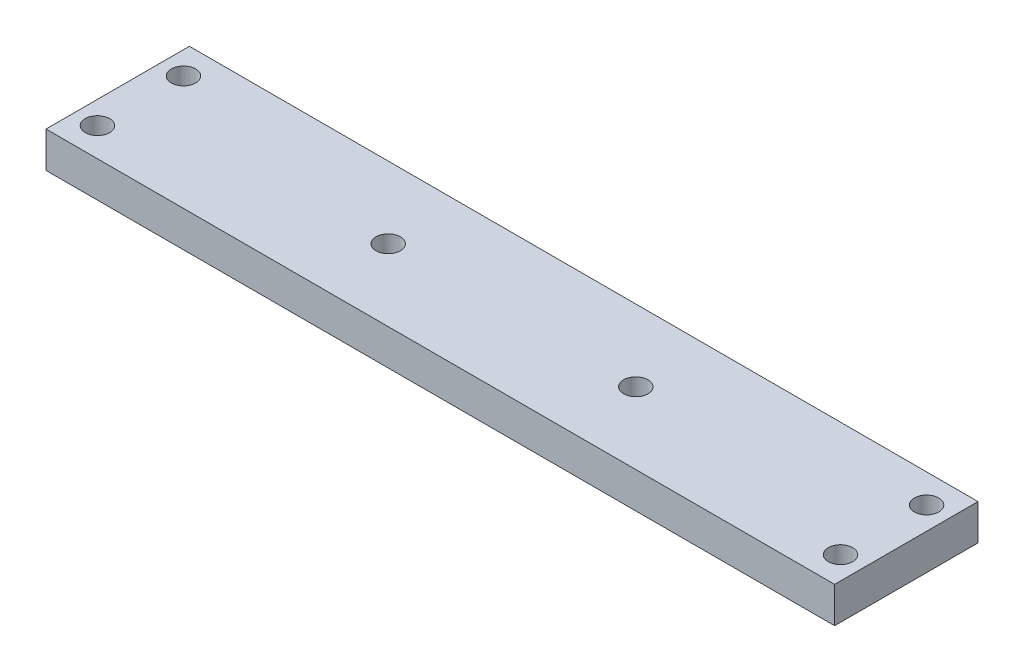
ISO-10303-21;
HEADER;
FILE_DESCRIPTION(('STEP AP214'),'2;1');
FILE_NAME('part.step','',(''),(''),'','','');
FILE_SCHEMA(('AUTOMOTIVE_DESIGN { 1 0 10303 214 1 1 1 1 }'));
ENDSEC;
DATA;
#1=APPLICATION_CONTEXT('core data for automotive mechanical design processes');
#2=APPLICATION_PROTOCOL_DEFINITION('international standard','automotive_design',2000,#1);
#3=PRODUCT_CONTEXT('',#1,'mechanical');
#4=PRODUCT('Part','Part','',(#3));
#5=PRODUCT_RELATED_PRODUCT_CATEGORY('part','',(#4));
#6=PRODUCT_DEFINITION_FORMATION('','',#4);
#7=PRODUCT_DEFINITION_CONTEXT('part definition',#1,'design');
#8=PRODUCT_DEFINITION('design','',#6,#7);
#9=PRODUCT_DEFINITION_SHAPE('','',#8);
#10=(LENGTH_UNIT() NAMED_UNIT(*) SI_UNIT(.MILLI.,.METRE.));
#11=(NAMED_UNIT(*) PLANE_ANGLE_UNIT() SI_UNIT($,.RADIAN.));
#12=(NAMED_UNIT(*) SI_UNIT($,.STERADIAN.) SOLID_ANGLE_UNIT());
#13=UNCERTAINTY_MEASURE_WITH_UNIT(LENGTH_MEASURE(1.E-05),#10,'distance_accuracy_value','');
#14=(GEOMETRIC_REPRESENTATION_CONTEXT(3) GLOBAL_UNCERTAINTY_ASSIGNED_CONTEXT((#13)) GLOBAL_UNIT_ASSIGNED_CONTEXT((#10,
#11,#12)) REPRESENTATION_CONTEXT('',''));
#15=CARTESIAN_POINT('',(0.,0.,0.));
#16=DIRECTION('',(0.,0.,1.));
#17=DIRECTION('',(1.,0.,0.));
#18=AXIS2_PLACEMENT_3D('',#15,#16,#17);
#19=CARTESIAN_POINT('',(0.,-2.5,0.));
#20=DIRECTION('',(0.,-1.,0.));
#21=DIRECTION('',(0.,0.,-1.));
#22=AXIS2_PLACEMENT_3D('',#19,#20,#21);
#23=PLANE('',#22);
#24=CARTESIAN_POINT('',(17.275,-2.5,0.));
#25=DIRECTION('',(0.,1.,0.));
#26=DIRECTION('',(0.,0.,1.));
#27=AXIS2_PLACEMENT_3D('',#24,#25,#26);
#28=CIRCLE('',#27,1.7);
#29=CARTESIAN_POINT('',(17.275,-2.5,1.7));
#30=VERTEX_POINT('',#29);
#31=EDGE_CURVE('E122',#30,#30,#28,.T.);
#32=ORIENTED_EDGE('',*,*,#31,.T.);
#33=EDGE_LOOP('',(#32));
#34=FACE_BOUND('',#33,.T.);
#35=CARTESIAN_POINT('',(-17.275,-2.5,0.));
#36=DIRECTION('',(0.,1.,0.));
#37=DIRECTION('',(0.,0.,1.));
#38=AXIS2_PLACEMENT_3D('',#35,#36,#37);
#39=CIRCLE('',#38,1.7);
#40=CARTESIAN_POINT('',(-17.275,-2.5,1.7));
#41=VERTEX_POINT('',#40);
#42=EDGE_CURVE('E106',#41,#41,#39,.T.);
#43=ORIENTED_EDGE('',*,*,#42,.T.);
#44=EDGE_LOOP('',(#43));
#45=FACE_BOUND('',#44,.T.);
#46=DIRECTION('',(0.,0.,-1.));
#47=VECTOR('',#46,1.);
#48=CARTESIAN_POINT('',(55.,-2.5,10.));
#49=LINE('',#48,#47);
#50=CARTESIAN_POINT('',(55.,-2.5,10.));
#51=VERTEX_POINT('',#50);
#52=CARTESIAN_POINT('',(55.,-2.5,-10.));
#53=VERTEX_POINT('',#52);
#54=EDGE_CURVE('E103',#51,#53,#49,.T.);
#55=ORIENTED_EDGE('',*,*,#54,.F.);
#56=DIRECTION('',(1.,0.,0.));
#57=VECTOR('',#56,1.);
#58=CARTESIAN_POINT('',(-55.,-2.5,10.));
#59=LINE('',#58,#57);
#60=CARTESIAN_POINT('',(-55.,-2.5,10.));
#61=VERTEX_POINT('',#60);
#62=EDGE_CURVE('E79',#61,#51,#59,.T.);
#63=ORIENTED_EDGE('',*,*,#62,.F.);
#64=DIRECTION('',(0.,0.,1.));
#65=VECTOR('',#64,1.);
#66=CARTESIAN_POINT('',(-55.,-2.5,10.));
#67=LINE('',#66,#65);
#68=CARTESIAN_POINT('',(-55.,-2.5,-10.));
#69=VERTEX_POINT('',#68);
#70=EDGE_CURVE('E73',#69,#61,#67,.T.);
#71=ORIENTED_EDGE('',*,*,#70,.F.);
#72=DIRECTION('',(-1.,0.,0.));
#73=VECTOR('',#72,1.);
#74=CARTESIAN_POINT('',(-55.,-2.5,-10.));
#75=LINE('',#74,#73);
#76=EDGE_CURVE('E95',#53,#69,#75,.T.);
#77=ORIENTED_EDGE('',*,*,#76,.F.);
#78=EDGE_LOOP('',(#55,#63,#71,#77));
#79=FACE_BOUND('',#78,.T.);
#80=CARTESIAN_POINT('',(51.825,-2.5,-5.99999999999998));
#81=DIRECTION('',(0.,1.,0.));
#82=DIRECTION('',(0.,0.,1.));
#83=AXIS2_PLACEMENT_3D('',#80,#81,#82);
#84=CIRCLE('',#83,1.7);
#85=CARTESIAN_POINT('',(51.825,-2.5,-4.29999999999998));
#86=VERTEX_POINT('',#85);
#87=EDGE_CURVE('E128',#86,#86,#84,.T.);
#88=ORIENTED_EDGE('',*,*,#87,.T.);
#89=EDGE_LOOP('',(#88));
#90=FACE_BOUND('',#89,.T.);
#91=CARTESIAN_POINT('',(-51.825,-2.5,-5.99999999999999));
#92=DIRECTION('',(0.,1.,0.));
#93=DIRECTION('',(0.,0.,1.));
#94=AXIS2_PLACEMENT_3D('',#91,#92,#93);
#95=CIRCLE('',#94,1.7);
#96=CARTESIAN_POINT('',(-51.825,-2.5,-4.29999999999999));
#97=VERTEX_POINT('',#96);
#98=EDGE_CURVE('E134',#97,#97,#95,.T.);
#99=ORIENTED_EDGE('',*,*,#98,.T.);
#100=EDGE_LOOP('',(#99));
#101=FACE_BOUND('',#100,.T.);
#102=CARTESIAN_POINT('',(51.825,-2.5,5.99999999999998));
#103=DIRECTION('',(0.,1.,0.));
#104=DIRECTION('',(0.,0.,1.));
#105=AXIS2_PLACEMENT_3D('',#102,#103,#104);
#106=CIRCLE('',#105,1.7);
#107=CARTESIAN_POINT('',(51.825,-2.5,7.69999999999998));
#108=VERTEX_POINT('',#107);
#109=EDGE_CURVE('E140',#108,#108,#106,.T.);
#110=ORIENTED_EDGE('',*,*,#109,.T.);
#111=EDGE_LOOP('',(#110));
#112=FACE_BOUND('',#111,.T.);
#113=CARTESIAN_POINT('',(-51.825,-2.5,5.99999999999999));
#114=DIRECTION('',(0.,1.,0.));
#115=DIRECTION('',(0.,0.,1.));
#116=AXIS2_PLACEMENT_3D('',#113,#114,#115);
#117=CIRCLE('',#116,1.7);
#118=CARTESIAN_POINT('',(-51.825,-2.5,7.69999999999999));
#119=VERTEX_POINT('',#118);
#120=EDGE_CURVE('E146',#119,#119,#117,.T.);
#121=ORIENTED_EDGE('',*,*,#120,.T.);
#122=EDGE_LOOP('',(#121));
#123=FACE_BOUND('',#122,.T.);
#124=ADVANCED_FACE('F39',(#34,#45,#79,#90,#101,#112,#123),#23,.T.);
#125=CARTESIAN_POINT('',(55.,2.5,10.));
#126=DIRECTION('',(-1.,0.,0.));
#127=DIRECTION('',(0.,0.,1.));
#128=AXIS2_PLACEMENT_3D('',#125,#126,#127);
#129=PLANE('',#128);
#130=ORIENTED_EDGE('',*,*,#54,.T.);
#131=DIRECTION('',(0.,-1.,0.));
#132=VECTOR('',#131,1.);
#133=CARTESIAN_POINT('',(55.,2.5,-10.));
#134=LINE('',#133,#132);
#135=CARTESIAN_POINT('',(55.,2.5,-10.));
#136=VERTEX_POINT('',#135);
#137=EDGE_CURVE('E11',#136,#53,#134,.T.);
#138=ORIENTED_EDGE('',*,*,#137,.F.);
#139=DIRECTION('',(0.,0.,-1.));
#140=VECTOR('',#139,1.);
#141=CARTESIAN_POINT('',(55.,2.5,10.));
#142=LINE('',#141,#140);
#143=CARTESIAN_POINT('',(55.,2.5,10.));
#144=VERTEX_POINT('',#143);
#145=EDGE_CURVE('E91',#144,#136,#142,.T.);
#146=ORIENTED_EDGE('',*,*,#145,.F.);
#147=DIRECTION('',(0.,-1.,0.));
#148=VECTOR('',#147,1.);
#149=CARTESIAN_POINT('',(55.,2.5,10.));
#150=LINE('',#149,#148);
#151=EDGE_CURVE('E99',#144,#51,#150,.T.);
#152=ORIENTED_EDGE('',*,*,#151,.T.);
#153=EDGE_LOOP('',(#130,#138,#146,#152));
#154=FACE_BOUND('',#153,.T.);
#155=ADVANCED_FACE('F41',(#154),#129,.F.);
#156=CARTESIAN_POINT('',(-55.,2.5,-10.));
#157=DIRECTION('',(0.,0.,1.));
#158=DIRECTION('',(1.,0.,0.));
#159=AXIS2_PLACEMENT_3D('',#156,#157,#158);
#160=PLANE('',#159);
#161=ORIENTED_EDGE('',*,*,#76,.T.);
#162=DIRECTION('',(0.,-1.,0.));
#163=VECTOR('',#162,1.);
#164=CARTESIAN_POINT('',(-55.,2.5,-10.));
#165=LINE('',#164,#163);
#166=CARTESIAN_POINT('',(-55.,2.5,-10.));
#167=VERTEX_POINT('',#166);
#168=EDGE_CURVE('E48',#167,#69,#165,.T.);
#169=ORIENTED_EDGE('',*,*,#168,.F.);
#170=DIRECTION('',(-1.,0.,0.));
#171=VECTOR('',#170,1.);
#172=CARTESIAN_POINT('',(-55.,2.5,-10.));
#173=LINE('',#172,#171);
#174=EDGE_CURVE('E86',#136,#167,#173,.T.);
#175=ORIENTED_EDGE('',*,*,#174,.F.);
#176=ORIENTED_EDGE('',*,*,#137,.T.);
#177=EDGE_LOOP('',(#161,#169,#175,#176));
#178=FACE_BOUND('',#177,.T.);
#179=ADVANCED_FACE('F94',(#178),#160,.F.);
#180=CARTESIAN_POINT('',(-55.,2.5,10.));
#181=DIRECTION('',(1.,0.,0.));
#182=DIRECTION('',(0.,0.,-1.));
#183=AXIS2_PLACEMENT_3D('',#180,#181,#182);
#184=PLANE('',#183);
#185=ORIENTED_EDGE('',*,*,#70,.T.);
#186=DIRECTION('',(0.,-1.,0.));
#187=VECTOR('',#186,1.);
#188=CARTESIAN_POINT('',(-55.,2.5,10.));
#189=LINE('',#188,#187);
#190=CARTESIAN_POINT('',(-55.,2.5,10.));
#191=VERTEX_POINT('',#190);
#192=EDGE_CURVE('E96',#191,#61,#189,.T.);
#193=ORIENTED_EDGE('',*,*,#192,.F.);
#194=DIRECTION('',(0.,0.,1.));
#195=VECTOR('',#194,1.);
#196=CARTESIAN_POINT('',(-55.,2.5,10.));
#197=LINE('',#196,#195);
#198=EDGE_CURVE('E89',#167,#191,#197,.T.);
#199=ORIENTED_EDGE('',*,*,#198,.F.);
#200=ORIENTED_EDGE('',*,*,#168,.T.);
#201=EDGE_LOOP('',(#185,#193,#199,#200));
#202=FACE_BOUND('',#201,.T.);
#203=ADVANCED_FACE('F97',(#202),#184,.F.);
#204=CARTESIAN_POINT('',(-55.,2.5,10.));
#205=DIRECTION('',(0.,0.,-1.));
#206=DIRECTION('',(-1.,0.,0.));
#207=AXIS2_PLACEMENT_3D('',#204,#205,#206);
#208=PLANE('',#207);
#209=ORIENTED_EDGE('',*,*,#62,.T.);
#210=ORIENTED_EDGE('',*,*,#151,.F.);
#211=DIRECTION('',(1.,0.,0.));
#212=VECTOR('',#211,1.);
#213=CARTESIAN_POINT('',(-55.,2.5,10.));
#214=LINE('',#213,#212);
#215=EDGE_CURVE('E56',#191,#144,#214,.T.);
#216=ORIENTED_EDGE('',*,*,#215,.F.);
#217=ORIENTED_EDGE('',*,*,#192,.T.);
#218=EDGE_LOOP('',(#209,#210,#216,#217));
#219=FACE_BOUND('',#218,.T.);
#220=ADVANCED_FACE('F111',(#219),#208,.F.);
#221=CARTESIAN_POINT('',(0.,2.5,0.));
#222=DIRECTION('',(0.,-1.,0.));
#223=DIRECTION('',(0.,0.,-1.));
#224=AXIS2_PLACEMENT_3D('',#221,#222,#223);
#225=PLANE('',#224);
#226=CARTESIAN_POINT('',(-51.825,2.5,5.99999999999999));
#227=DIRECTION('',(0.,1.,0.));
#228=DIRECTION('',(0.,0.,1.));
#229=AXIS2_PLACEMENT_3D('',#226,#227,#228);
#230=CIRCLE('',#229,1.7);
#231=CARTESIAN_POINT('',(-51.825,2.5,7.69999999999999));
#232=VERTEX_POINT('',#231);
#233=EDGE_CURVE('E149',#232,#232,#230,.T.);
#234=ORIENTED_EDGE('',*,*,#233,.F.);
#235=EDGE_LOOP('',(#234));
#236=FACE_BOUND('',#235,.T.);
#237=CARTESIAN_POINT('',(51.825,2.5,5.99999999999998));
#238=DIRECTION('',(0.,1.,0.));
#239=DIRECTION('',(0.,0.,1.));
#240=AXIS2_PLACEMENT_3D('',#237,#238,#239);
#241=CIRCLE('',#240,1.7);
#242=CARTESIAN_POINT('',(51.825,2.5,7.69999999999998));
#243=VERTEX_POINT('',#242);
#244=EDGE_CURVE('E143',#243,#243,#241,.T.);
#245=ORIENTED_EDGE('',*,*,#244,.F.);
#246=EDGE_LOOP('',(#245));
#247=FACE_BOUND('',#246,.T.);
#248=CARTESIAN_POINT('',(-51.825,2.5,-5.99999999999999));
#249=DIRECTION('',(0.,1.,0.));
#250=DIRECTION('',(0.,0.,1.));
#251=AXIS2_PLACEMENT_3D('',#248,#249,#250);
#252=CIRCLE('',#251,1.7);
#253=CARTESIAN_POINT('',(-51.825,2.5,-4.29999999999999));
#254=VERTEX_POINT('',#253);
#255=EDGE_CURVE('E137',#254,#254,#252,.T.);
#256=ORIENTED_EDGE('',*,*,#255,.F.);
#257=EDGE_LOOP('',(#256));
#258=FACE_BOUND('',#257,.T.);
#259=CARTESIAN_POINT('',(51.825,2.5,-5.99999999999998));
#260=DIRECTION('',(0.,1.,0.));
#261=DIRECTION('',(0.,0.,1.));
#262=AXIS2_PLACEMENT_3D('',#259,#260,#261);
#263=CIRCLE('',#262,1.7);
#264=CARTESIAN_POINT('',(51.825,2.5,-4.29999999999998));
#265=VERTEX_POINT('',#264);
#266=EDGE_CURVE('E131',#265,#265,#263,.T.);
#267=ORIENTED_EDGE('',*,*,#266,.F.);
#268=EDGE_LOOP('',(#267));
#269=FACE_BOUND('',#268,.T.);
#270=CARTESIAN_POINT('',(17.275,2.5,0.));
#271=DIRECTION('',(0.,1.,0.));
#272=DIRECTION('',(0.,0.,1.));
#273=AXIS2_PLACEMENT_3D('',#270,#271,#272);
#274=CIRCLE('',#273,1.7);
#275=CARTESIAN_POINT('',(17.275,2.5,1.7));
#276=VERTEX_POINT('',#275);
#277=EDGE_CURVE('E125',#276,#276,#274,.T.);
#278=ORIENTED_EDGE('',*,*,#277,.F.);
#279=EDGE_LOOP('',(#278));
#280=FACE_BOUND('',#279,.T.);
#281=CARTESIAN_POINT('',(-17.275,2.5,0.));
#282=DIRECTION('',(0.,1.,0.));
#283=DIRECTION('',(0.,0.,1.));
#284=AXIS2_PLACEMENT_3D('',#281,#282,#283);
#285=CIRCLE('',#284,1.7);
#286=CARTESIAN_POINT('',(-17.275,2.5,1.7));
#287=VERTEX_POINT('',#286);
#288=EDGE_CURVE('E119',#287,#287,#285,.T.);
#289=ORIENTED_EDGE('',*,*,#288,.F.);
#290=EDGE_LOOP('',(#289));
#291=FACE_BOUND('',#290,.T.);
#292=ORIENTED_EDGE('',*,*,#145,.T.);
#293=ORIENTED_EDGE('',*,*,#174,.T.);
#294=ORIENTED_EDGE('',*,*,#198,.T.);
#295=ORIENTED_EDGE('',*,*,#215,.T.);
#296=EDGE_LOOP('',(#292,#293,#294,#295));
#297=FACE_BOUND('',#296,.T.);
#298=ADVANCED_FACE('F87',(#236,#247,#258,#269,#280,#291,#297),#225,.F.);
#299=CARTESIAN_POINT('',(-17.275,2.5,0.));
#300=DIRECTION('',(0.,1.,0.));
#301=DIRECTION('',(0.,0.,1.));
#302=AXIS2_PLACEMENT_3D('',#299,#300,#301);
#303=CYLINDRICAL_SURFACE('',#302,1.7);
#304=ORIENTED_EDGE('',*,*,#42,.F.);
#305=EDGE_LOOP('',(#304));
#306=FACE_BOUND('',#305,.T.);
#307=ORIENTED_EDGE('',*,*,#288,.T.);
#308=EDGE_LOOP('',(#307));
#309=FACE_BOUND('',#308,.T.);
#310=ADVANCED_FACE('F157',(#306,#309),#303,.F.);
#311=CARTESIAN_POINT('',(17.275,2.5,0.));
#312=DIRECTION('',(0.,1.,0.));
#313=DIRECTION('',(0.,0.,1.));
#314=AXIS2_PLACEMENT_3D('',#311,#312,#313);
#315=CYLINDRICAL_SURFACE('',#314,1.7);
#316=ORIENTED_EDGE('',*,*,#31,.F.);
#317=EDGE_LOOP('',(#316));
#318=FACE_BOUND('',#317,.T.);
#319=ORIENTED_EDGE('',*,*,#277,.T.);
#320=EDGE_LOOP('',(#319));
#321=FACE_BOUND('',#320,.T.);
#322=ADVANCED_FACE('F170',(#318,#321),#315,.F.);
#323=CARTESIAN_POINT('',(51.825,2.5,-5.99999999999998));
#324=DIRECTION('',(0.,1.,0.));
#325=DIRECTION('',(0.,0.,1.));
#326=AXIS2_PLACEMENT_3D('',#323,#324,#325);
#327=CYLINDRICAL_SURFACE('',#326,1.7);
#328=ORIENTED_EDGE('',*,*,#87,.F.);
#329=EDGE_LOOP('',(#328));
#330=FACE_BOUND('',#329,.T.);
#331=ORIENTED_EDGE('',*,*,#266,.T.);
#332=EDGE_LOOP('',(#331));
#333=FACE_BOUND('',#332,.T.);
#334=ADVANCED_FACE('F176',(#330,#333),#327,.F.);
#335=CARTESIAN_POINT('',(-51.825,2.5,-5.99999999999999));
#336=DIRECTION('',(0.,1.,0.));
#337=DIRECTION('',(0.,0.,1.));
#338=AXIS2_PLACEMENT_3D('',#335,#336,#337);
#339=CYLINDRICAL_SURFACE('',#338,1.7);
#340=ORIENTED_EDGE('',*,*,#98,.F.);
#341=EDGE_LOOP('',(#340));
#342=FACE_BOUND('',#341,.T.);
#343=ORIENTED_EDGE('',*,*,#255,.T.);
#344=EDGE_LOOP('',(#343));
#345=FACE_BOUND('',#344,.T.);
#346=ADVANCED_FACE('F236',(#342,#345),#339,.F.);
#347=CARTESIAN_POINT('',(51.825,2.5,5.99999999999998));
#348=DIRECTION('',(0.,1.,0.));
#349=DIRECTION('',(0.,0.,1.));
#350=AXIS2_PLACEMENT_3D('',#347,#348,#349);
#351=CYLINDRICAL_SURFACE('',#350,1.7);
#352=ORIENTED_EDGE('',*,*,#109,.F.);
#353=EDGE_LOOP('',(#352));
#354=FACE_BOUND('',#353,.T.);
#355=ORIENTED_EDGE('',*,*,#244,.T.);
#356=EDGE_LOOP('',(#355));
#357=FACE_BOUND('',#356,.T.);
#358=ADVANCED_FACE('F246',(#354,#357),#351,.F.);
#359=CARTESIAN_POINT('',(-51.825,2.5,5.99999999999999));
#360=DIRECTION('',(0.,1.,0.));
#361=DIRECTION('',(0.,0.,1.));
#362=AXIS2_PLACEMENT_3D('',#359,#360,#361);
#363=CYLINDRICAL_SURFACE('',#362,1.7);
#364=ORIENTED_EDGE('',*,*,#120,.F.);
#365=EDGE_LOOP('',(#364));
#366=FACE_BOUND('',#365,.T.);
#367=ORIENTED_EDGE('',*,*,#233,.T.);
#368=EDGE_LOOP('',(#367));
#369=FACE_BOUND('',#368,.T.);
#370=ADVANCED_FACE('F153',(#366,#369),#363,.F.);
#371=CLOSED_SHELL('',(#124,#155,#179,#203,#220,#298,#310,#322,#334,#346,#358,#370));
#372=MANIFOLD_SOLID_BREP('B2',#371);
#373=ADVANCED_BREP_SHAPE_REPRESENTATION('',(#18,#372),#14);
#374=SHAPE_DEFINITION_REPRESENTATION(#9,#373);
ENDSEC;
END-ISO-10303-21;
